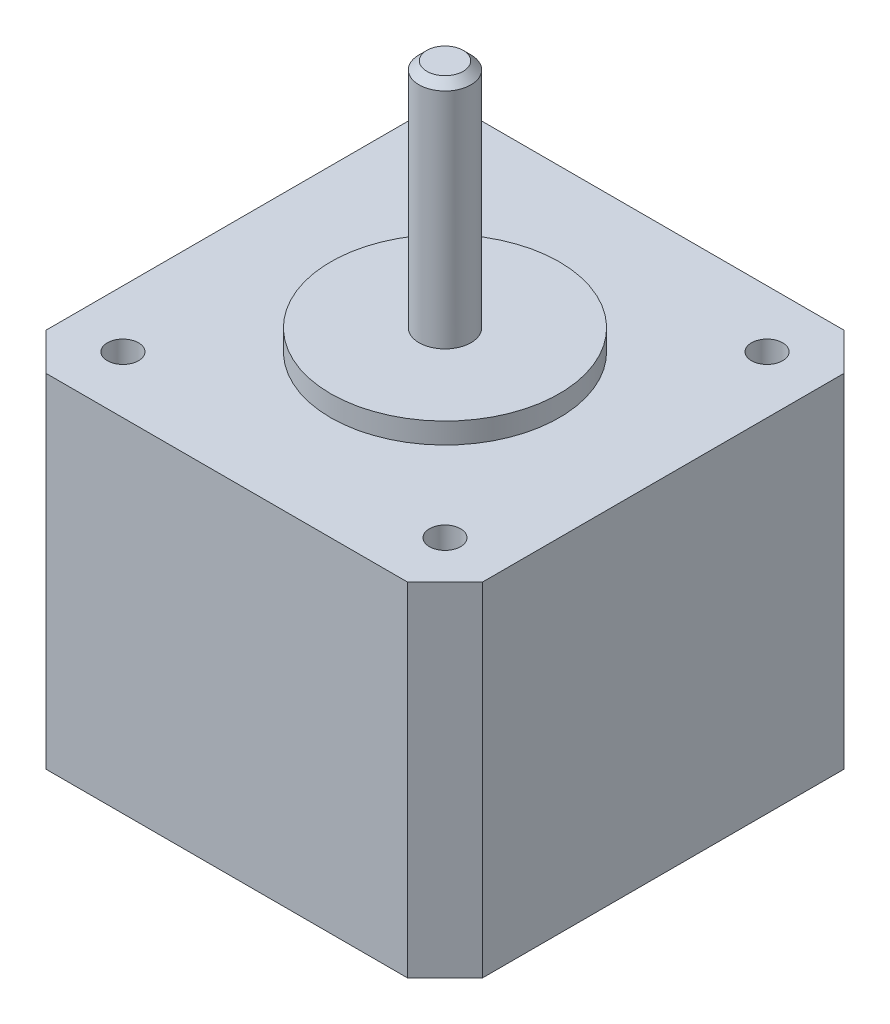
ISO-10303-21;
HEADER;
FILE_DESCRIPTION(('STEP AP214'),'2;1');
FILE_NAME('part.step','',(''),(''),'','','');
FILE_SCHEMA(('AUTOMOTIVE_DESIGN { 1 0 10303 214 1 1 1 1 }'));
ENDSEC;
DATA;
#1=APPLICATION_CONTEXT('core data for automotive mechanical design processes');
#2=APPLICATION_PROTOCOL_DEFINITION('international standard','automotive_design',2000,#1);
#3=PRODUCT_CONTEXT('',#1,'mechanical');
#4=PRODUCT('Part','Part','',(#3));
#5=PRODUCT_RELATED_PRODUCT_CATEGORY('part','',(#4));
#6=PRODUCT_DEFINITION_FORMATION('','',#4);
#7=PRODUCT_DEFINITION_CONTEXT('part definition',#1,'design');
#8=PRODUCT_DEFINITION('design','',#6,#7);
#9=PRODUCT_DEFINITION_SHAPE('','',#8);
#10=(LENGTH_UNIT() NAMED_UNIT(*) SI_UNIT(.MILLI.,.METRE.));
#11=(NAMED_UNIT(*) PLANE_ANGLE_UNIT() SI_UNIT($,.RADIAN.));
#12=(NAMED_UNIT(*) SI_UNIT($,.STERADIAN.) SOLID_ANGLE_UNIT());
#13=UNCERTAINTY_MEASURE_WITH_UNIT(LENGTH_MEASURE(1.E-05),#10,'distance_accuracy_value','');
#14=(GEOMETRIC_REPRESENTATION_CONTEXT(3) GLOBAL_UNCERTAINTY_ASSIGNED_CONTEXT((#13)) GLOBAL_UNIT_ASSIGNED_CONTEXT((#10,
#11,#12)) REPRESENTATION_CONTEXT('',''));
#15=CARTESIAN_POINT('',(0.,0.,0.));
#16=DIRECTION('',(0.,0.,1.));
#17=DIRECTION('',(1.,0.,0.));
#18=AXIS2_PLACEMENT_3D('',#15,#16,#17);
#19=CARTESIAN_POINT('',(21.,33.,-21.));
#20=DIRECTION('',(-1.,0.,0.));
#21=DIRECTION('',(0.,0.,1.));
#22=AXIS2_PLACEMENT_3D('',#19,#20,#21);
#23=PLANE('',#22);
#24=DIRECTION('',(0.,0.,-1.));
#25=VECTOR('',#24,1.);
#26=CARTESIAN_POINT('',(21.,33.,-21.));
#27=LINE('',#26,#25);
#28=CARTESIAN_POINT('',(21.,33.,17.4));
#29=VERTEX_POINT('',#28);
#30=CARTESIAN_POINT('',(21.,33.,-17.4));
#31=VERTEX_POINT('',#30);
#32=EDGE_CURVE('E126',#29,#31,#27,.T.);
#33=ORIENTED_EDGE('',*,*,#32,.F.);
#34=DIRECTION('',(0.,-1.,0.));
#35=VECTOR('',#34,1.);
#36=CARTESIAN_POINT('',(21.,33.,17.4));
#37=LINE('',#36,#35);
#38=CARTESIAN_POINT('',(21.,0.,17.4));
#39=VERTEX_POINT('',#38);
#40=EDGE_CURVE('E152',#29,#39,#37,.T.);
#41=ORIENTED_EDGE('',*,*,#40,.T.);
#42=DIRECTION('',(0.,0.,-1.));
#43=VECTOR('',#42,1.);
#44=CARTESIAN_POINT('',(21.,0.,-21.));
#45=LINE('',#44,#43);
#46=CARTESIAN_POINT('',(21.,0.,-17.4));
#47=VERTEX_POINT('',#46);
#48=EDGE_CURVE('E215',#39,#47,#45,.T.);
#49=ORIENTED_EDGE('',*,*,#48,.T.);
#50=DIRECTION('',(0.,1.,0.));
#51=VECTOR('',#50,1.);
#52=CARTESIAN_POINT('',(21.,33.,-17.4));
#53=LINE('',#52,#51);
#54=EDGE_CURVE('E150',#47,#31,#53,.T.);
#55=ORIENTED_EDGE('',*,*,#54,.T.);
#56=EDGE_LOOP('',(#33,#41,#49,#55));
#57=FACE_BOUND('',#56,.T.);
#58=ADVANCED_FACE('F33',(#57),#23,.F.);
#59=CARTESIAN_POINT('',(-21.,33.,-21.));
#60=DIRECTION('',(0.,0.,1.));
#61=DIRECTION('',(1.,0.,0.));
#62=AXIS2_PLACEMENT_3D('',#59,#60,#61);
#63=PLANE('',#62);
#64=DIRECTION('',(-1.,0.,0.));
#65=VECTOR('',#64,1.);
#66=CARTESIAN_POINT('',(-21.,33.,-21.));
#67=LINE('',#66,#65);
#68=CARTESIAN_POINT('',(17.4,33.,-21.));
#69=VERTEX_POINT('',#68);
#70=CARTESIAN_POINT('',(-17.4,33.,-21.));
#71=VERTEX_POINT('',#70);
#72=EDGE_CURVE('E129',#69,#71,#67,.T.);
#73=ORIENTED_EDGE('',*,*,#72,.F.);
#74=DIRECTION('',(0.,-1.,0.));
#75=VECTOR('',#74,1.);
#76=CARTESIAN_POINT('',(17.4,33.,-21.));
#77=LINE('',#76,#75);
#78=CARTESIAN_POINT('',(17.4,0.,-21.));
#79=VERTEX_POINT('',#78);
#80=EDGE_CURVE('E156',#69,#79,#77,.T.);
#81=ORIENTED_EDGE('',*,*,#80,.T.);
#82=DIRECTION('',(-1.,0.,0.));
#83=VECTOR('',#82,1.);
#84=CARTESIAN_POINT('',(-21.,0.,-21.));
#85=LINE('',#84,#83);
#86=CARTESIAN_POINT('',(-17.4,0.,-21.));
#87=VERTEX_POINT('',#86);
#88=EDGE_CURVE('E131',#79,#87,#85,.T.);
#89=ORIENTED_EDGE('',*,*,#88,.T.);
#90=DIRECTION('',(0.,1.,0.));
#91=VECTOR('',#90,1.);
#92=CARTESIAN_POINT('',(-17.4,33.,-21.));
#93=LINE('',#92,#91);
#94=EDGE_CURVE('E48',#87,#71,#93,.T.);
#95=ORIENTED_EDGE('',*,*,#94,.T.);
#96=EDGE_LOOP('',(#73,#81,#89,#95));
#97=FACE_BOUND('',#96,.T.);
#98=ADVANCED_FACE('F174',(#97),#63,.F.);
#99=CARTESIAN_POINT('',(-21.,33.,-21.));
#100=DIRECTION('',(1.,0.,0.));
#101=DIRECTION('',(0.,0.,-1.));
#102=AXIS2_PLACEMENT_3D('',#99,#100,#101);
#103=PLANE('',#102);
#104=DIRECTION('',(0.,0.,1.));
#105=VECTOR('',#104,1.);
#106=CARTESIAN_POINT('',(-21.,0.,-21.));
#107=LINE('',#106,#105);
#108=CARTESIAN_POINT('',(-21.,0.,-17.4));
#109=VERTEX_POINT('',#108);
#110=CARTESIAN_POINT('',(-21.,0.,17.4));
#111=VERTEX_POINT('',#110);
#112=EDGE_CURVE('E127',#109,#111,#107,.T.);
#113=ORIENTED_EDGE('',*,*,#112,.T.);
#114=DIRECTION('',(0.,1.,0.));
#115=VECTOR('',#114,1.);
#116=CARTESIAN_POINT('',(-21.,33.,17.4));
#117=LINE('',#116,#115);
#118=CARTESIAN_POINT('',(-21.,33.,17.4));
#119=VERTEX_POINT('',#118);
#120=EDGE_CURVE('E105',#111,#119,#117,.T.);
#121=ORIENTED_EDGE('',*,*,#120,.T.);
#122=DIRECTION('',(0.,0.,1.));
#123=VECTOR('',#122,1.);
#124=CARTESIAN_POINT('',(-21.,33.,-21.));
#125=LINE('',#124,#123);
#126=CARTESIAN_POINT('',(-21.,33.,-17.4));
#127=VERTEX_POINT('',#126);
#128=EDGE_CURVE('E209',#127,#119,#125,.T.);
#129=ORIENTED_EDGE('',*,*,#128,.F.);
#130=DIRECTION('',(0.,-1.,0.));
#131=VECTOR('',#130,1.);
#132=CARTESIAN_POINT('',(-21.,33.,-17.4));
#133=LINE('',#132,#131);
#134=EDGE_CURVE('E110',#127,#109,#133,.T.);
#135=ORIENTED_EDGE('',*,*,#134,.T.);
#136=EDGE_LOOP('',(#113,#121,#129,#135));
#137=FACE_BOUND('',#136,.T.);
#138=ADVANCED_FACE('F180',(#137),#103,.F.);
#139=CARTESIAN_POINT('',(-21.,33.,21.));
#140=DIRECTION('',(0.,0.,-1.));
#141=DIRECTION('',(-1.,0.,0.));
#142=AXIS2_PLACEMENT_3D('',#139,#140,#141);
#143=PLANE('',#142);
#144=DIRECTION('',(1.,0.,0.));
#145=VECTOR('',#144,1.);
#146=CARTESIAN_POINT('',(-21.,33.,21.));
#147=LINE('',#146,#145);
#148=CARTESIAN_POINT('',(-17.4,33.,21.));
#149=VERTEX_POINT('',#148);
#150=CARTESIAN_POINT('',(17.4,33.,21.));
#151=VERTEX_POINT('',#150);
#152=EDGE_CURVE('E120',#149,#151,#147,.T.);
#153=ORIENTED_EDGE('',*,*,#152,.F.);
#154=DIRECTION('',(0.,-1.,0.));
#155=VECTOR('',#154,1.);
#156=CARTESIAN_POINT('',(-17.4,33.,21.));
#157=LINE('',#156,#155);
#158=CARTESIAN_POINT('',(-17.4,0.,21.));
#159=VERTEX_POINT('',#158);
#160=EDGE_CURVE('E104',#149,#159,#157,.T.);
#161=ORIENTED_EDGE('',*,*,#160,.T.);
#162=DIRECTION('',(1.,0.,0.));
#163=VECTOR('',#162,1.);
#164=CARTESIAN_POINT('',(-21.,0.,21.));
#165=LINE('',#164,#163);
#166=CARTESIAN_POINT('',(17.4,0.,21.));
#167=VERTEX_POINT('',#166);
#168=EDGE_CURVE('E117',#159,#167,#165,.T.);
#169=ORIENTED_EDGE('',*,*,#168,.T.);
#170=DIRECTION('',(0.,1.,0.));
#171=VECTOR('',#170,1.);
#172=CARTESIAN_POINT('',(17.4,33.,21.));
#173=LINE('',#172,#171);
#174=EDGE_CURVE('E122',#167,#151,#173,.T.);
#175=ORIENTED_EDGE('',*,*,#174,.T.);
#176=EDGE_LOOP('',(#153,#161,#169,#175));
#177=FACE_BOUND('',#176,.T.);
#178=ADVANCED_FACE('F116',(#177),#143,.F.);
#179=CARTESIAN_POINT('',(0.,33.,0.));
#180=DIRECTION('',(0.,1.,0.));
#181=DIRECTION('',(0.,0.,1.));
#182=AXIS2_PLACEMENT_3D('',#179,#180,#181);
#183=PLANE('',#182);
#184=CARTESIAN_POINT('',(-15.5,33.,-15.5));
#185=DIRECTION('',(0.,1.,0.));
#186=DIRECTION('',(0.,0.,1.));
#187=AXIS2_PLACEMENT_3D('',#184,#185,#186);
#188=CIRCLE('',#187,1.5);
#189=CARTESIAN_POINT('',(-15.5,33.,-14.));
#190=VERTEX_POINT('',#189);
#191=EDGE_CURVE('E253',#190,#190,#188,.T.);
#192=ORIENTED_EDGE('',*,*,#191,.F.);
#193=EDGE_LOOP('',(#192));
#194=FACE_BOUND('',#193,.T.);
#195=CARTESIAN_POINT('',(-15.5,33.,15.5));
#196=DIRECTION('',(0.,1.,0.));
#197=DIRECTION('',(0.,0.,1.));
#198=AXIS2_PLACEMENT_3D('',#195,#196,#197);
#199=CIRCLE('',#198,1.5);
#200=CARTESIAN_POINT('',(-15.5,33.,17.));
#201=VERTEX_POINT('',#200);
#202=EDGE_CURVE('E247',#201,#201,#199,.T.);
#203=ORIENTED_EDGE('',*,*,#202,.F.);
#204=EDGE_LOOP('',(#203));
#205=FACE_BOUND('',#204,.T.);
#206=CARTESIAN_POINT('',(15.5,33.,15.5));
#207=DIRECTION('',(0.,1.,0.));
#208=DIRECTION('',(0.,0.,1.));
#209=AXIS2_PLACEMENT_3D('',#206,#207,#208);
#210=CIRCLE('',#209,1.5);
#211=CARTESIAN_POINT('',(15.5,33.,17.));
#212=VERTEX_POINT('',#211);
#213=EDGE_CURVE('E241',#212,#212,#210,.T.);
#214=ORIENTED_EDGE('',*,*,#213,.F.);
#215=EDGE_LOOP('',(#214));
#216=FACE_BOUND('',#215,.T.);
#217=CARTESIAN_POINT('',(15.5,33.,-15.5));
#218=DIRECTION('',(0.,1.,0.));
#219=DIRECTION('',(0.,0.,1.));
#220=AXIS2_PLACEMENT_3D('',#217,#218,#219);
#221=CIRCLE('',#220,1.5);
#222=CARTESIAN_POINT('',(15.5,33.,-14.));
#223=VERTEX_POINT('',#222);
#224=EDGE_CURVE('E235',#223,#223,#221,.T.);
#225=ORIENTED_EDGE('',*,*,#224,.F.);
#226=EDGE_LOOP('',(#225));
#227=FACE_BOUND('',#226,.T.);
#228=CARTESIAN_POINT('',(0.,33.,0.));
#229=DIRECTION('',(0.,1.,0.));
#230=DIRECTION('',(0.,0.,1.));
#231=AXIS2_PLACEMENT_3D('',#228,#229,#230);
#232=CIRCLE('',#231,11.);
#233=CARTESIAN_POINT('',(0.,33.,11.));
#234=VERTEX_POINT('',#233);
#235=EDGE_CURVE('E224',#234,#234,#232,.T.);
#236=ORIENTED_EDGE('',*,*,#235,.F.);
#237=EDGE_LOOP('',(#236));
#238=FACE_BOUND('',#237,.T.);
#239=ORIENTED_EDGE('',*,*,#128,.T.);
#240=DIRECTION('',(-0.707106781186546,0.,-0.707106781186549));
#241=VECTOR('',#240,1.);
#242=CARTESIAN_POINT('',(-19.2,33.,19.2));
#243=LINE('',#242,#241);
#244=EDGE_CURVE('E148',#119,#149,#243,.F.);
#245=ORIENTED_EDGE('',*,*,#244,.T.);
#246=ORIENTED_EDGE('',*,*,#152,.T.);
#247=DIRECTION('',(-0.707106781186549,0.,0.707106781186547));
#248=VECTOR('',#247,1.);
#249=CARTESIAN_POINT('',(19.2,33.,19.2));
#250=LINE('',#249,#248);
#251=EDGE_CURVE('E146',#151,#29,#250,.F.);
#252=ORIENTED_EDGE('',*,*,#251,.T.);
#253=ORIENTED_EDGE('',*,*,#32,.T.);
#254=DIRECTION('',(0.707106781186547,0.,0.707106781186548));
#255=VECTOR('',#254,1.);
#256=CARTESIAN_POINT('',(19.2,33.,-19.2));
#257=LINE('',#256,#255);
#258=EDGE_CURVE('E55',#31,#69,#257,.F.);
#259=ORIENTED_EDGE('',*,*,#258,.T.);
#260=ORIENTED_EDGE('',*,*,#72,.T.);
#261=DIRECTION('',(0.707106781186549,0.,-0.707106781186546));
#262=VECTOR('',#261,1.);
#263=CARTESIAN_POINT('',(-19.2,33.,-19.2));
#264=LINE('',#263,#262);
#265=EDGE_CURVE('E143',#71,#127,#264,.F.);
#266=ORIENTED_EDGE('',*,*,#265,.T.);
#267=EDGE_LOOP('',(#239,#245,#246,#252,#253,#259,#260,#266));
#268=FACE_BOUND('',#267,.T.);
#269=ADVANCED_FACE('F208',(#194,#205,#216,#227,#238,#268),#183,.T.);
#270=CARTESIAN_POINT('',(0.,0.,0.));
#271=DIRECTION('',(0.,1.,0.));
#272=DIRECTION('',(0.,0.,1.));
#273=AXIS2_PLACEMENT_3D('',#270,#271,#272);
#274=PLANE('',#273);
#275=ORIENTED_EDGE('',*,*,#168,.F.);
#276=DIRECTION('',(0.707106781186546,0.,0.707106781186549));
#277=VECTOR('',#276,1.);
#278=CARTESIAN_POINT('',(-17.4,0.,21.));
#279=LINE('',#278,#277);
#280=EDGE_CURVE('E100',#159,#111,#279,.F.);
#281=ORIENTED_EDGE('',*,*,#280,.T.);
#282=ORIENTED_EDGE('',*,*,#112,.F.);
#283=DIRECTION('',(-0.707106781186549,0.,0.707106781186546));
#284=VECTOR('',#283,1.);
#285=CARTESIAN_POINT('',(-21.,0.,-17.4));
#286=LINE('',#285,#284);
#287=EDGE_CURVE('E121',#109,#87,#286,.F.);
#288=ORIENTED_EDGE('',*,*,#287,.T.);
#289=ORIENTED_EDGE('',*,*,#88,.F.);
#290=DIRECTION('',(-0.707106781186547,0.,-0.707106781186548));
#291=VECTOR('',#290,1.);
#292=CARTESIAN_POINT('',(17.4,0.,-21.));
#293=LINE('',#292,#291);
#294=EDGE_CURVE('E137',#79,#47,#293,.F.);
#295=ORIENTED_EDGE('',*,*,#294,.T.);
#296=ORIENTED_EDGE('',*,*,#48,.F.);
#297=DIRECTION('',(0.707106781186549,0.,-0.707106781186547));
#298=VECTOR('',#297,1.);
#299=CARTESIAN_POINT('',(21.,0.,17.4));
#300=LINE('',#299,#298);
#301=EDGE_CURVE('E111',#39,#167,#300,.F.);
#302=ORIENTED_EDGE('',*,*,#301,.T.);
#303=EDGE_LOOP('',(#275,#281,#282,#288,#289,#295,#296,#302));
#304=FACE_BOUND('',#303,.T.);
#305=ADVANCED_FACE('F124',(#304),#274,.F.);
#306=CARTESIAN_POINT('',(0.,35.,0.));
#307=DIRECTION('',(0.,-1.,0.));
#308=DIRECTION('',(0.,0.,-1.));
#309=AXIS2_PLACEMENT_3D('',#306,#307,#308);
#310=CYLINDRICAL_SURFACE('',#309,11.);
#311=CARTESIAN_POINT('',(0.,35.,0.));
#312=DIRECTION('',(0.,1.,0.));
#313=DIRECTION('',(0.,0.,1.));
#314=AXIS2_PLACEMENT_3D('',#311,#312,#313);
#315=CIRCLE('',#314,11.);
#316=CARTESIAN_POINT('',(0.,35.,11.));
#317=VERTEX_POINT('',#316);
#318=EDGE_CURVE('E217',#317,#317,#315,.T.);
#319=ORIENTED_EDGE('',*,*,#318,.F.);
#320=EDGE_LOOP('',(#319));
#321=FACE_BOUND('',#320,.T.);
#322=ORIENTED_EDGE('',*,*,#235,.T.);
#323=EDGE_LOOP('',(#322));
#324=FACE_BOUND('',#323,.T.);
#325=ADVANCED_FACE('F276',(#321,#324),#310,.T.);
#326=CARTESIAN_POINT('',(0.,35.,0.));
#327=DIRECTION('',(0.,1.,0.));
#328=DIRECTION('',(0.,0.,1.));
#329=AXIS2_PLACEMENT_3D('',#326,#327,#328);
#330=PLANE('',#329);
#331=CARTESIAN_POINT('',(0.,35.,0.));
#332=DIRECTION('',(0.,1.,0.));
#333=DIRECTION('',(0.,0.,1.));
#334=AXIS2_PLACEMENT_3D('',#331,#332,#333);
#335=CIRCLE('',#334,2.5);
#336=CARTESIAN_POINT('',(0.,35.,2.5));
#337=VERTEX_POINT('',#336);
#338=EDGE_CURVE('E229',#337,#337,#335,.T.);
#339=ORIENTED_EDGE('',*,*,#338,.F.);
#340=EDGE_LOOP('',(#339));
#341=FACE_BOUND('',#340,.T.);
#342=ORIENTED_EDGE('',*,*,#318,.T.);
#343=EDGE_LOOP('',(#342));
#344=FACE_BOUND('',#343,.T.);
#345=ADVANCED_FACE('F278',(#341,#344),#330,.T.);
#346=CARTESIAN_POINT('',(0.,57.25,0.));
#347=DIRECTION('',(0.,-1.,0.));
#348=DIRECTION('',(0.,0.,-1.));
#349=AXIS2_PLACEMENT_3D('',#346,#347,#348);
#350=CYLINDRICAL_SURFACE('',#349,2.5);
#351=CARTESIAN_POINT('',(0.,56.5,0.));
#352=DIRECTION('',(0.,1.,0.));
#353=DIRECTION('',(0.,0.,1.));
#354=AXIS2_PLACEMENT_3D('',#351,#352,#353);
#355=CIRCLE('',#354,2.5);
#356=CARTESIAN_POINT('',(0.,56.5,-2.5));
#357=VERTEX_POINT('',#356);
#358=EDGE_CURVE('E11',#357,#357,#355,.F.);
#359=ORIENTED_EDGE('',*,*,#358,.T.);
#360=EDGE_LOOP('',(#359));
#361=FACE_BOUND('',#360,.T.);
#362=ORIENTED_EDGE('',*,*,#338,.T.);
#363=EDGE_LOOP('',(#362));
#364=FACE_BOUND('',#363,.T.);
#365=ADVANCED_FACE('F285',(#361,#364),#350,.T.);
#366=CARTESIAN_POINT('',(0.,57.25,0.));
#367=DIRECTION('',(0.,1.,0.));
#368=DIRECTION('',(0.,0.,1.));
#369=AXIS2_PLACEMENT_3D('',#366,#367,#368);
#370=PLANE('',#369);
#371=CARTESIAN_POINT('',(0.,57.25,0.));
#372=DIRECTION('',(0.,1.,0.));
#373=DIRECTION('',(0.,0.,1.));
#374=AXIS2_PLACEMENT_3D('',#371,#372,#373);
#375=CIRCLE('',#374,1.75000000000001);
#376=CARTESIAN_POINT('',(0.,57.25,-1.75000000000001));
#377=VERTEX_POINT('',#376);
#378=EDGE_CURVE('E41',#377,#377,#375,.T.);
#379=ORIENTED_EDGE('',*,*,#378,.T.);
#380=EDGE_LOOP('',(#379));
#381=FACE_BOUND('',#380,.T.);
#382=ADVANCED_FACE('F161',(#381),#370,.T.);
#383=CARTESIAN_POINT('',(-17.4,33.,21.));
#384=DIRECTION('',(0.707106781186549,0.,-0.707106781186546));
#385=DIRECTION('',(0.,-1.,0.));
#386=AXIS2_PLACEMENT_3D('',#383,#384,#385);
#387=PLANE('',#386);
#388=ORIENTED_EDGE('',*,*,#244,.F.);
#389=ORIENTED_EDGE('',*,*,#120,.F.);
#390=ORIENTED_EDGE('',*,*,#280,.F.);
#391=ORIENTED_EDGE('',*,*,#160,.F.);
#392=EDGE_LOOP('',(#388,#389,#390,#391));
#393=FACE_BOUND('',#392,.T.);
#394=ADVANCED_FACE('F103',(#393),#387,.F.);
#395=CARTESIAN_POINT('',(21.,33.,17.4));
#396=DIRECTION('',(-0.707106781186546,0.,-0.707106781186548));
#397=DIRECTION('',(0.,-1.,0.));
#398=AXIS2_PLACEMENT_3D('',#395,#396,#397);
#399=PLANE('',#398);
#400=ORIENTED_EDGE('',*,*,#251,.F.);
#401=ORIENTED_EDGE('',*,*,#174,.F.);
#402=ORIENTED_EDGE('',*,*,#301,.F.);
#403=ORIENTED_EDGE('',*,*,#40,.F.);
#404=EDGE_LOOP('',(#400,#401,#402,#403));
#405=FACE_BOUND('',#404,.T.);
#406=ADVANCED_FACE('F187',(#405),#399,.F.);
#407=CARTESIAN_POINT('',(17.4,33.,-21.));
#408=DIRECTION('',(-0.707106781186548,0.,0.707106781186547));
#409=DIRECTION('',(0.,-1.,0.));
#410=AXIS2_PLACEMENT_3D('',#407,#408,#409);
#411=PLANE('',#410);
#412=ORIENTED_EDGE('',*,*,#258,.F.);
#413=ORIENTED_EDGE('',*,*,#54,.F.);
#414=ORIENTED_EDGE('',*,*,#294,.F.);
#415=ORIENTED_EDGE('',*,*,#80,.F.);
#416=EDGE_LOOP('',(#412,#413,#414,#415));
#417=FACE_BOUND('',#416,.T.);
#418=ADVANCED_FACE('F190',(#417),#411,.F.);
#419=CARTESIAN_POINT('',(-21.,33.,-17.4));
#420=DIRECTION('',(0.707106781186546,0.,0.707106781186549));
#421=DIRECTION('',(0.,-1.,0.));
#422=AXIS2_PLACEMENT_3D('',#419,#420,#421);
#423=PLANE('',#422);
#424=ORIENTED_EDGE('',*,*,#265,.F.);
#425=ORIENTED_EDGE('',*,*,#94,.F.);
#426=ORIENTED_EDGE('',*,*,#287,.F.);
#427=ORIENTED_EDGE('',*,*,#134,.F.);
#428=EDGE_LOOP('',(#424,#425,#426,#427));
#429=FACE_BOUND('',#428,.T.);
#430=ADVANCED_FACE('F193',(#429),#423,.F.);
#431=CARTESIAN_POINT('',(15.5,28.,-15.5));
#432=DIRECTION('',(0.,1.,0.));
#433=DIRECTION('',(0.,0.,1.));
#434=AXIS2_PLACEMENT_3D('',#431,#432,#433);
#435=CYLINDRICAL_SURFACE('',#434,1.5);
#436=CARTESIAN_POINT('',(15.5,28.,-15.5));
#437=DIRECTION('',(0.,1.,0.));
#438=DIRECTION('',(0.,0.,1.));
#439=AXIS2_PLACEMENT_3D('',#436,#437,#438);
#440=CIRCLE('',#439,1.5);
#441=CARTESIAN_POINT('',(15.5,28.,-14.));
#442=VERTEX_POINT('',#441);
#443=EDGE_CURVE('E234',#442,#442,#440,.T.);
#444=ORIENTED_EDGE('',*,*,#443,.F.);
#445=EDGE_LOOP('',(#444));
#446=FACE_BOUND('',#445,.T.);
#447=ORIENTED_EDGE('',*,*,#224,.T.);
#448=EDGE_LOOP('',(#447));
#449=FACE_BOUND('',#448,.T.);
#450=ADVANCED_FACE('F196',(#446,#449),#435,.F.);
#451=CARTESIAN_POINT('',(15.5,28.,-15.5));
#452=DIRECTION('',(0.,1.,0.));
#453=DIRECTION('',(0.,0.,1.));
#454=AXIS2_PLACEMENT_3D('',#451,#452,#453);
#455=PLANE('',#454);
#456=ORIENTED_EDGE('',*,*,#443,.T.);
#457=EDGE_LOOP('',(#456));
#458=FACE_BOUND('',#457,.T.);
#459=ADVANCED_FACE('F201',(#458),#455,.T.);
#460=CARTESIAN_POINT('',(15.5,28.,15.5));
#461=DIRECTION('',(0.,1.,0.));
#462=DIRECTION('',(0.,0.,1.));
#463=AXIS2_PLACEMENT_3D('',#460,#461,#462);
#464=CYLINDRICAL_SURFACE('',#463,1.5);
#465=CARTESIAN_POINT('',(15.5,28.,15.5));
#466=DIRECTION('',(0.,1.,0.));
#467=DIRECTION('',(0.,0.,1.));
#468=AXIS2_PLACEMENT_3D('',#465,#466,#467);
#469=CIRCLE('',#468,1.5);
#470=CARTESIAN_POINT('',(15.5,28.,17.));
#471=VERTEX_POINT('',#470);
#472=EDGE_CURVE('E238',#471,#471,#469,.T.);
#473=ORIENTED_EDGE('',*,*,#472,.F.);
#474=EDGE_LOOP('',(#473));
#475=FACE_BOUND('',#474,.T.);
#476=ORIENTED_EDGE('',*,*,#213,.T.);
#477=EDGE_LOOP('',(#476));
#478=FACE_BOUND('',#477,.T.);
#479=ADVANCED_FACE('F351',(#475,#478),#464,.F.);
#480=CARTESIAN_POINT('',(15.5,28.,15.5));
#481=DIRECTION('',(0.,1.,0.));
#482=DIRECTION('',(0.,0.,1.));
#483=AXIS2_PLACEMENT_3D('',#480,#481,#482);
#484=PLANE('',#483);
#485=ORIENTED_EDGE('',*,*,#472,.T.);
#486=EDGE_LOOP('',(#485));
#487=FACE_BOUND('',#486,.T.);
#488=ADVANCED_FACE('F360',(#487),#484,.T.);
#489=CARTESIAN_POINT('',(-15.5,28.,15.5));
#490=DIRECTION('',(0.,1.,0.));
#491=DIRECTION('',(0.,0.,1.));
#492=AXIS2_PLACEMENT_3D('',#489,#490,#491);
#493=CYLINDRICAL_SURFACE('',#492,1.5);
#494=CARTESIAN_POINT('',(-15.5,28.,15.5));
#495=DIRECTION('',(0.,1.,0.));
#496=DIRECTION('',(0.,0.,1.));
#497=AXIS2_PLACEMENT_3D('',#494,#495,#496);
#498=CIRCLE('',#497,1.5);
#499=CARTESIAN_POINT('',(-15.5,28.,17.));
#500=VERTEX_POINT('',#499);
#501=EDGE_CURVE('E244',#500,#500,#498,.T.);
#502=ORIENTED_EDGE('',*,*,#501,.F.);
#503=EDGE_LOOP('',(#502));
#504=FACE_BOUND('',#503,.T.);
#505=ORIENTED_EDGE('',*,*,#202,.T.);
#506=EDGE_LOOP('',(#505));
#507=FACE_BOUND('',#506,.T.);
#508=ADVANCED_FACE('F369',(#504,#507),#493,.F.);
#509=CARTESIAN_POINT('',(-15.5,28.,15.5));
#510=DIRECTION('',(0.,1.,0.));
#511=DIRECTION('',(0.,0.,1.));
#512=AXIS2_PLACEMENT_3D('',#509,#510,#511);
#513=PLANE('',#512);
#514=ORIENTED_EDGE('',*,*,#501,.T.);
#515=EDGE_LOOP('',(#514));
#516=FACE_BOUND('',#515,.T.);
#517=ADVANCED_FACE('F261',(#516),#513,.T.);
#518=CARTESIAN_POINT('',(-15.5,28.,-15.5));
#519=DIRECTION('',(0.,1.,0.));
#520=DIRECTION('',(0.,0.,1.));
#521=AXIS2_PLACEMENT_3D('',#518,#519,#520);
#522=CYLINDRICAL_SURFACE('',#521,1.5);
#523=CARTESIAN_POINT('',(-15.5,28.,-15.5));
#524=DIRECTION('',(0.,1.,0.));
#525=DIRECTION('',(0.,0.,1.));
#526=AXIS2_PLACEMENT_3D('',#523,#524,#525);
#527=CIRCLE('',#526,1.5);
#528=CARTESIAN_POINT('',(-15.5,28.,-14.));
#529=VERTEX_POINT('',#528);
#530=EDGE_CURVE('E250',#529,#529,#527,.T.);
#531=ORIENTED_EDGE('',*,*,#530,.F.);
#532=EDGE_LOOP('',(#531));
#533=FACE_BOUND('',#532,.T.);
#534=ORIENTED_EDGE('',*,*,#191,.T.);
#535=EDGE_LOOP('',(#534));
#536=FACE_BOUND('',#535,.T.);
#537=ADVANCED_FACE('F169',(#533,#536),#522,.F.);
#538=CARTESIAN_POINT('',(-15.5,28.,-15.5));
#539=DIRECTION('',(0.,1.,0.));
#540=DIRECTION('',(0.,0.,1.));
#541=AXIS2_PLACEMENT_3D('',#538,#539,#540);
#542=PLANE('',#541);
#543=ORIENTED_EDGE('',*,*,#530,.T.);
#544=EDGE_LOOP('',(#543));
#545=FACE_BOUND('',#544,.T.);
#546=ADVANCED_FACE('F164',(#545),#542,.T.);
#547=CARTESIAN_POINT('',(0.,57.25,0.));
#548=DIRECTION('',(0.,-1.,0.));
#549=DIRECTION('',(0.,0.,-1.));
#550=AXIS2_PLACEMENT_3D('',#547,#548,#549);
#551=CONICAL_SURFACE('',#550,1.75000000000001,0.785398163397447);
#552=CARTESIAN_POINT('',(0.,56.5,-2.5));
#553=CARTESIAN_POINT('',(0.,56.5078125,-2.4921875));
#554=CARTESIAN_POINT('',(0.,56.515625,-2.484375));
#555=CARTESIAN_POINT('',(0.,56.53125,-2.46875));
#556=CARTESIAN_POINT('',(0.,56.5390625,-2.4609375));
#557=CARTESIAN_POINT('',(0.,56.5546875,-2.4453125));
#558=CARTESIAN_POINT('',(0.,56.5625,-2.4375));
#559=CARTESIAN_POINT('',(0.,56.578125,-2.421875));
#560=CARTESIAN_POINT('',(0.,56.5859375,-2.4140625));
#561=CARTESIAN_POINT('',(0.,56.6015625,-2.3984375));
#562=CARTESIAN_POINT('',(0.,56.609375,-2.390625));
#563=CARTESIAN_POINT('',(0.,56.625,-2.37500000000001));
#564=CARTESIAN_POINT('',(0.,56.6328125,-2.36718750000001));
#565=CARTESIAN_POINT('',(0.,56.6484375,-2.35156250000001));
#566=CARTESIAN_POINT('',(0.,56.65625,-2.34375000000001));
#567=CARTESIAN_POINT('',(0.,56.671875,-2.328125));
#568=CARTESIAN_POINT('',(0.,56.6796875,-2.32031250000001));
#569=CARTESIAN_POINT('',(0.,56.6953125,-2.30468750000001));
#570=CARTESIAN_POINT('',(0.,56.703125,-2.29687500000001));
#571=CARTESIAN_POINT('',(0.,56.71875,-2.28125000000001));
#572=CARTESIAN_POINT('',(0.,56.7265625,-2.27343750000001));
#573=CARTESIAN_POINT('',(0.,56.7421875,-2.25781250000001));
#574=CARTESIAN_POINT('',(0.,56.75,-2.25000000000001));
#575=CARTESIAN_POINT('',(0.,56.765625,-2.23437500000001));
#576=CARTESIAN_POINT('',(0.,56.7734375,-2.22656250000001));
#577=CARTESIAN_POINT('',(0.,56.7890625,-2.21093750000001));
#578=CARTESIAN_POINT('',(0.,56.796875,-2.20312500000001));
#579=CARTESIAN_POINT('',(0.,56.8125,-2.18750000000001));
#580=CARTESIAN_POINT('',(0.,56.8203125,-2.17968750000001));
#581=CARTESIAN_POINT('',(0.,56.8359375,-2.16406250000001));
#582=CARTESIAN_POINT('',(0.,56.84375,-2.15625000000001));
#583=CARTESIAN_POINT('',(0.,56.859375,-2.14062500000001));
#584=CARTESIAN_POINT('',(0.,56.8671875,-2.13281250000001));
#585=CARTESIAN_POINT('',(0.,56.8828125,-2.11718750000001));
#586=CARTESIAN_POINT('',(0.,56.890625,-2.10937500000001));
#587=CARTESIAN_POINT('',(0.,56.90625,-2.09375000000001));
#588=CARTESIAN_POINT('',(0.,56.9140625,-2.08593750000001));
#589=CARTESIAN_POINT('',(0.,56.9296875,-2.07031250000001));
#590=CARTESIAN_POINT('',(0.,56.9375,-2.06250000000001));
#591=CARTESIAN_POINT('',(0.,56.953125,-2.04687500000001));
#592=CARTESIAN_POINT('',(0.,56.9609375,-2.03906250000001));
#593=CARTESIAN_POINT('',(0.,56.9765625,-2.02343750000001));
#594=CARTESIAN_POINT('',(0.,56.984375,-2.01562500000001));
#595=CARTESIAN_POINT('',(0.,57.,-2.00000000000001));
#596=CARTESIAN_POINT('',(0.,57.0078125,-1.99218750000001));
#597=CARTESIAN_POINT('',(0.,57.0234375,-1.97656250000001));
#598=CARTESIAN_POINT('',(0.,57.03125,-1.96875000000001));
#599=CARTESIAN_POINT('',(0.,57.046875,-1.95312500000001));
#600=CARTESIAN_POINT('',(0.,57.0546875,-1.94531250000001));
#601=CARTESIAN_POINT('',(0.,57.0703125,-1.92968750000001));
#602=CARTESIAN_POINT('',(0.,57.078125,-1.92187500000001));
#603=CARTESIAN_POINT('',(0.,57.09375,-1.90625000000001));
#604=CARTESIAN_POINT('',(0.,57.1015625,-1.89843750000001));
#605=CARTESIAN_POINT('',(0.,57.1171875,-1.88281250000001));
#606=CARTESIAN_POINT('',(0.,57.125,-1.87500000000001));
#607=CARTESIAN_POINT('',(0.,57.140625,-1.85937500000001));
#608=CARTESIAN_POINT('',(0.,57.1484375,-1.85156250000001));
#609=CARTESIAN_POINT('',(0.,57.1640625,-1.83593750000001));
#610=CARTESIAN_POINT('',(0.,57.171875,-1.82812500000001));
#611=CARTESIAN_POINT('',(0.,57.1875,-1.81250000000001));
#612=CARTESIAN_POINT('',(0.,57.1953125,-1.80468750000001));
#613=CARTESIAN_POINT('',(0.,57.2109375,-1.78906250000001));
#614=CARTESIAN_POINT('',(0.,57.21875,-1.78125000000001));
#615=CARTESIAN_POINT('',(0.,57.234375,-1.76562500000001));
#616=CARTESIAN_POINT('',(0.,57.2421875,-1.75781250000001));
#617=CARTESIAN_POINT('',(0.,57.25,-1.75000000000001));
#618=B_SPLINE_CURVE_WITH_KNOTS('',3,(#552,#553,#554,#555,#556,#557,#558,#559,#560,#561,#562,
#563,#564,#565,#566,#567,#568,#569,#570,#571,#572,#573,#574,#575,#576,#577,#578,#579,#580,#581,
#582,#583,#584,#585,#586,#587,#588,#589,#590,#591,#592,#593,#594,#595,#596,#597,#598,#599,#600,
#601,#602,#603,#604,#605,#606,#607,#608,#609,#610,#611,#612,#613,#614,#615,#616,#617),
.UNSPECIFIED.,.F.,.F.,(4,2,2,2,2,2,2,2,2,2,2,2,2,2,2,2,2,2,2,2,2,2,2,2,2,2,2,2,2,2,2,2,4),(0.,
0.0331456303681201,0.0662912607362398,0.0994368911043596,0.13258252147248,0.165728151840599,
0.198873782208719,0.232019412576834,0.265165042944954,0.298310673313074,0.331456303681194,
0.364601934049314,0.397747564417434,0.430893194785548,0.464038825153669,0.497184455521788,
0.530330085889908,0.563475716258028,0.596621346626148,0.629766976994268,0.662912607362383,
0.696058237730502,0.729203868098622,0.762349498466742,0.795495128834862,0.828640759202982,
0.861786389571097,0.894932019939217,0.928077650307337,0.961223280675456,0.994368911043576,
1.0275145414117,1.06066017177982),.UNSPECIFIED.);
#619=EDGE_CURVE('BSEAM35',#357,#377,#618,.T.);
#620=ORIENTED_EDGE('',*,*,#358,.F.);
#621=ORIENTED_EDGE('',*,*,#378,.F.);
#622=ORIENTED_EDGE('',*,*,#619,.T.);
#623=ORIENTED_EDGE('',*,*,#619,.F.);
#624=EDGE_LOOP('',(#620,#622,#621,#623));
#625=FACE_BOUND('',#624,.T.);
#626=ADVANCED_FACE('F35',(#625),#551,.T.);
#627=CLOSED_SHELL('',(#58,#98,#138,#178,#269,#305,#325,#345,#365,#382,#394,#406,#418,#430,#450,
#459,#479,#488,#508,#517,#537,#546,#626));
#628=MANIFOLD_SOLID_BREP('B2',#627);
#629=ADVANCED_BREP_SHAPE_REPRESENTATION('',(#18,#628),#14);
#630=SHAPE_DEFINITION_REPRESENTATION(#9,#629);
ENDSEC;
END-ISO-10303-21;
